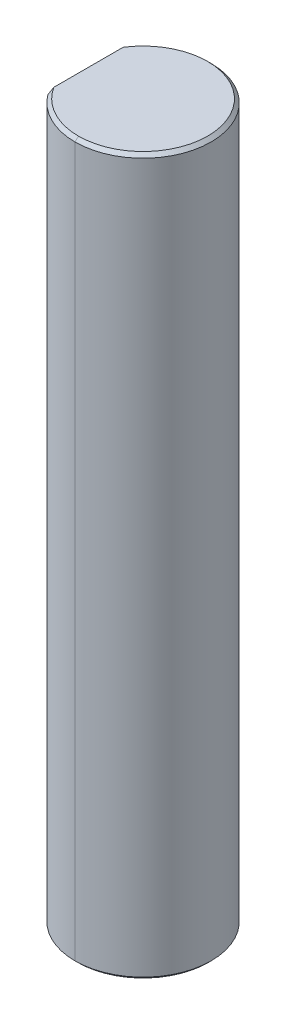
ISO-10303-21;
HEADER;
FILE_DESCRIPTION(('STEP AP214'),'2;1');
FILE_NAME('part.step','',(''),(''),'','','');
FILE_SCHEMA(('AUTOMOTIVE_DESIGN { 1 0 10303 214 1 1 1 1 }'));
ENDSEC;
DATA;
#1=APPLICATION_CONTEXT('core data for automotive mechanical design processes');
#2=APPLICATION_PROTOCOL_DEFINITION('international standard','automotive_design',2000,#1);
#3=PRODUCT_CONTEXT('',#1,'mechanical');
#4=PRODUCT('Part','Part','',(#3));
#5=PRODUCT_RELATED_PRODUCT_CATEGORY('part','',(#4));
#6=PRODUCT_DEFINITION_FORMATION('','',#4);
#7=PRODUCT_DEFINITION_CONTEXT('part definition',#1,'design');
#8=PRODUCT_DEFINITION('design','',#6,#7);
#9=PRODUCT_DEFINITION_SHAPE('','',#8);
#10=(LENGTH_UNIT() NAMED_UNIT(*) SI_UNIT(.MILLI.,.METRE.));
#11=(NAMED_UNIT(*) PLANE_ANGLE_UNIT() SI_UNIT($,.RADIAN.));
#12=(NAMED_UNIT(*) SI_UNIT($,.STERADIAN.) SOLID_ANGLE_UNIT());
#13=UNCERTAINTY_MEASURE_WITH_UNIT(LENGTH_MEASURE(1.E-05),#10,'distance_accuracy_value','');
#14=(GEOMETRIC_REPRESENTATION_CONTEXT(3) GLOBAL_UNCERTAINTY_ASSIGNED_CONTEXT((#13)) GLOBAL_UNIT_ASSIGNED_CONTEXT((#10,
#11,#12)) REPRESENTATION_CONTEXT('',''));
#15=CARTESIAN_POINT('',(0.,0.,0.));
#16=DIRECTION('',(0.,0.,1.));
#17=DIRECTION('',(1.,0.,0.));
#18=AXIS2_PLACEMENT_3D('',#15,#16,#17);
#19=CARTESIAN_POINT('',(-2.54381,203.2,-1.89353550270387));
#20=DIRECTION('',(1.,0.,0.));
#21=DIRECTION('',(0.,1.,0.));
#22=AXIS2_PLACEMENT_3D('',#19,#20,#21);
#23=PLANE('',#22);
#24=DIRECTION('',(0.,0.,1.));
#25=VECTOR('',#24,1.);
#26=CARTESIAN_POINT('',(-2.54381,33.3375,-1.89353550270387));
#27=LINE('',#26,#25);
#28=CARTESIAN_POINT('',(-2.54381,33.3375,-1.61363733146577));
#29=VERTEX_POINT('',#28);
#30=CARTESIAN_POINT('',(-2.54381,33.3375,1.61363733146577));
#31=VERTEX_POINT('',#30);
#32=EDGE_CURVE('E181',#29,#31,#27,.T.);
#33=ORIENTED_EDGE('',*,*,#32,.F.);
#34=CARTESIAN_POINT('',(-2.54381,33.3375,-1.61363733146577));
#35=CARTESIAN_POINT('',(-2.54381,33.324835972846,-1.63727892069951));
#36=CARTESIAN_POINT('',(-2.54381,33.3120182044331,-1.66083787110422));
#37=CARTESIAN_POINT('',(-2.54381,33.2860954843602,-1.70779313460007));
#38=CARTESIAN_POINT('',(-2.54381,33.2729905717043,-1.73118946921832));
#39=CARTESIAN_POINT('',(-2.54381,33.2465105768963,-1.77782826832946));
#40=CARTESIAN_POINT('',(-2.54381,33.2331354976812,-1.80107073449142));
#41=CARTESIAN_POINT('',(-2.54381,33.2061298247341,-1.84741098770331));
#42=CARTESIAN_POINT('',(-2.54381,33.1924991967487,-1.87050875479636));
#43=CARTESIAN_POINT('',(-2.54381,33.17875,-1.89353550270388));
#44=B_SPLINE_CURVE_WITH_KNOTS('',3,(#34,#35,#36,#37,#38,#39,#40,#41,#42,#43),.UNSPECIFIED.,.F.,
.F.,(4,2,2,2,4),(0.,0.0804585075196043,0.160906152924485,0.24135292424592,0.321810556729131),.UNSPECIFIED.);
#45=CARTESIAN_POINT('',(-2.54381,33.17875,-1.89353550270387));
#46=VERTEX_POINT('',#45);
#47=EDGE_CURVE('E198',#29,#46,#44,.T.);
#48=ORIENTED_EDGE('',*,*,#47,.T.);
#49=DIRECTION('',(0.,-1.,0.));
#50=VECTOR('',#49,1.);
#51=CARTESIAN_POINT('',(-2.54381,203.2,-1.89353550270387));
#52=LINE('',#51,#50);
#53=CARTESIAN_POINT('',(-2.54381,0.127000000000044,-1.89353550270387));
#54=VERTEX_POINT('',#53);
#55=EDGE_CURVE('E163',#46,#54,#52,.T.);
#56=ORIENTED_EDGE('',*,*,#55,.T.);
#57=CARTESIAN_POINT('',(-2.54381,0.127000000000044,-1.89353550270387));
#58=CARTESIAN_POINT('',(-2.54381,0.0833862535559772,-1.82049357854219));
#59=CARTESIAN_POINT('',(-2.54381,0.0409575857320699,-1.74672509100728));
#60=CARTESIAN_POINT('',(-2.54381,0.,-1.67216130800824));
#61=(BOUNDED_CURVE() B_SPLINE_CURVE(3,(#57,#58,#59,#60),.UNSPECIFIED.,.F.,
.F.) B_SPLINE_CURVE_WITH_KNOTS((4,4),(0.,0.00025521664145809),
.UNSPECIFIED.) CURVE() GEOMETRIC_REPRESENTATION_ITEM() RATIONAL_B_SPLINE_CURVE((1.,1.,1.,1.)) REPRESENTATION_ITEM(''));
#62=CARTESIAN_POINT('',(-2.54381,0.,-1.67216130800824));
#63=VERTEX_POINT('',#62);
#64=EDGE_CURVE('E129',#54,#63,#61,.T.);
#65=ORIENTED_EDGE('',*,*,#64,.T.);
#66=DIRECTION('',(0.,0.,1.));
#67=VECTOR('',#66,1.);
#68=CARTESIAN_POINT('',(-2.54381,0.,-1.89353550270387));
#69=LINE('',#68,#67);
#70=CARTESIAN_POINT('',(-2.54381,0.,1.67216130800824));
#71=VERTEX_POINT('',#70);
#72=EDGE_CURVE('E123',#63,#71,#69,.T.);
#73=ORIENTED_EDGE('',*,*,#72,.T.);
#74=CARTESIAN_POINT('',(-2.54381,0.,1.67216130800824));
#75=CARTESIAN_POINT('',(-2.54381,0.040957585732076,1.74672509100728));
#76=CARTESIAN_POINT('',(-2.54381,0.0833862535559736,1.82049357854219));
#77=CARTESIAN_POINT('',(-2.54381,0.127000000000044,1.89353550270387));
#78=(BOUNDED_CURVE() B_SPLINE_CURVE(3,(#74,#75,#76,#77),.UNSPECIFIED.,.F.,
.F.) B_SPLINE_CURVE_WITH_KNOTS((4,4),(0.,0.00025521664145809),
.UNSPECIFIED.) CURVE() GEOMETRIC_REPRESENTATION_ITEM() RATIONAL_B_SPLINE_CURVE((1.,1.,1.,1.)) REPRESENTATION_ITEM(''));
#79=CARTESIAN_POINT('',(-2.54381,0.127000000000044,1.89353550270387));
#80=VERTEX_POINT('',#79);
#81=EDGE_CURVE('E126',#71,#80,#78,.T.);
#82=ORIENTED_EDGE('',*,*,#81,.T.);
#83=DIRECTION('',(0.,-1.,0.));
#84=VECTOR('',#83,1.);
#85=CARTESIAN_POINT('',(-2.54381,203.2,1.89353550270387));
#86=LINE('',#85,#84);
#87=CARTESIAN_POINT('',(-2.54381,33.17875,1.89353550270387));
#88=VERTEX_POINT('',#87);
#89=EDGE_CURVE('E166',#88,#80,#86,.T.);
#90=ORIENTED_EDGE('',*,*,#89,.F.);
#91=CARTESIAN_POINT('',(-2.54381,33.17875,1.89353550270387));
#92=CARTESIAN_POINT('',(-2.54381,33.1924991967487,1.87050875479636));
#93=CARTESIAN_POINT('',(-2.54381,33.2061298247341,1.8474109877033));
#94=CARTESIAN_POINT('',(-2.54381,33.2331354976812,1.80107073449142));
#95=CARTESIAN_POINT('',(-2.54381,33.2465105768963,1.77782826832946));
#96=CARTESIAN_POINT('',(-2.54381,33.2729905717043,1.73118946921832));
#97=CARTESIAN_POINT('',(-2.54381,33.2860954843602,1.70779313460007));
#98=CARTESIAN_POINT('',(-2.54381,33.3120182044331,1.66083787110422));
#99=CARTESIAN_POINT('',(-2.54381,33.324835972846,1.63727892069953));
#100=CARTESIAN_POINT('',(-2.54381,33.3375,1.6136373314658));
#101=B_SPLINE_CURVE_WITH_KNOTS('',3,(#91,#92,#93,#94,#95,#96,#97,#98,#99,#100),.UNSPECIFIED.,
.F.,.F.,(4,2,2,2,4),(0.,0.0804576324832107,0.160904403804646,0.241352049209526,
0.321810556729129),.UNSPECIFIED.);
#102=EDGE_CURVE('E191',#88,#31,#101,.T.);
#103=ORIENTED_EDGE('',*,*,#102,.T.);
#104=EDGE_LOOP('',(#33,#48,#56,#65,#73,#82,#90,#103));
#105=FACE_BOUND('',#104,.T.);
#106=ADVANCED_FACE('F45',(#105),#23,.F.);
#107=CARTESIAN_POINT('',(0.,203.2,0.));
#108=DIRECTION('',(0.,-1.,0.));
#109=DIRECTION('',(0.,0.,-1.));
#110=AXIS2_PLACEMENT_3D('',#107,#108,#109);
#111=CYLINDRICAL_SURFACE('',#110,3.17119);
#112=DIRECTION('',(0.,-1.,0.));
#113=VECTOR('',#112,1.);
#114=CARTESIAN_POINT('',(0.,203.2,3.17119));
#115=LINE('',#114,#113);
#116=CARTESIAN_POINT('',(0.,33.17875,3.17119));
#117=VERTEX_POINT('',#116);
#118=CARTESIAN_POINT('',(0.,0.127000000000044,3.17119));
#119=VERTEX_POINT('',#118);
#120=EDGE_CURVE('E143',#117,#119,#115,.T.);
#121=ORIENTED_EDGE('',*,*,#120,.F.);
#122=CARTESIAN_POINT('',(0.,33.17875,0.));
#123=DIRECTION('',(0.,1.,0.));
#124=DIRECTION('',(0.,0.,1.));
#125=AXIS2_PLACEMENT_3D('',#122,#123,#124);
#126=CIRCLE('',#125,3.17119);
#127=EDGE_CURVE('E14',#117,#88,#126,.F.);
#128=ORIENTED_EDGE('',*,*,#127,.T.);
#129=ORIENTED_EDGE('',*,*,#89,.T.);
#130=CARTESIAN_POINT('',(0.,0.127000000000044,0.));
#131=DIRECTION('',(0.,1.,0.));
#132=DIRECTION('',(0.,0.,1.));
#133=AXIS2_PLACEMENT_3D('',#130,#131,#132);
#134=CIRCLE('',#133,3.17119);
#135=EDGE_CURVE('E141',#80,#119,#134,.T.);
#136=ORIENTED_EDGE('',*,*,#135,.T.);
#137=EDGE_LOOP('',(#121,#128,#129,#136));
#138=FACE_BOUND('',#137,.T.);
#139=ADVANCED_FACE('F208',(#138),#111,.T.);
#140=CARTESIAN_POINT('',(0.,203.2,0.));
#141=DIRECTION('',(0.,-1.,0.));
#142=DIRECTION('',(0.,0.,-1.));
#143=AXIS2_PLACEMENT_3D('',#140,#141,#142);
#144=CYLINDRICAL_SURFACE('',#143,3.17119);
#145=ORIENTED_EDGE('',*,*,#55,.F.);
#146=CARTESIAN_POINT('',(0.,33.17875,0.));
#147=DIRECTION('',(0.,1.,0.));
#148=DIRECTION('',(0.,0.,1.));
#149=AXIS2_PLACEMENT_3D('',#146,#147,#148);
#150=CIRCLE('',#149,3.17119);
#151=CARTESIAN_POINT('',(0.,33.17875,-3.17119));
#152=VERTEX_POINT('',#151);
#153=EDGE_CURVE('E169',#46,#152,#150,.F.);
#154=ORIENTED_EDGE('',*,*,#153,.T.);
#155=DIRECTION('',(0.,-1.,0.));
#156=VECTOR('',#155,1.);
#157=CARTESIAN_POINT('',(0.,203.2,-3.17119));
#158=LINE('',#157,#156);
#159=CARTESIAN_POINT('',(0.,0.127000000000044,-3.17119));
#160=VERTEX_POINT('',#159);
#161=EDGE_CURVE('E164',#152,#160,#158,.T.);
#162=ORIENTED_EDGE('',*,*,#161,.T.);
#163=CARTESIAN_POINT('',(0.,0.127000000000044,0.));
#164=DIRECTION('',(0.,1.,0.));
#165=DIRECTION('',(0.,0.,1.));
#166=AXIS2_PLACEMENT_3D('',#163,#164,#165);
#167=CIRCLE('',#166,3.17119);
#168=EDGE_CURVE('E160',#160,#54,#167,.T.);
#169=ORIENTED_EDGE('',*,*,#168,.T.);
#170=EDGE_LOOP('',(#145,#154,#162,#169));
#171=FACE_BOUND('',#170,.T.);
#172=ADVANCED_FACE('F242',(#171),#144,.T.);
#173=CARTESIAN_POINT('',(0.,203.2,0.));
#174=DIRECTION('',(0.,-1.,0.));
#175=DIRECTION('',(0.,0.,-1.));
#176=AXIS2_PLACEMENT_3D('',#173,#174,#175);
#177=CYLINDRICAL_SURFACE('',#176,3.17119);
#178=ORIENTED_EDGE('',*,*,#161,.F.);
#179=CARTESIAN_POINT('',(0.,33.17875,0.));
#180=DIRECTION('',(0.,1.,0.));
#181=DIRECTION('',(0.,0.,1.));
#182=AXIS2_PLACEMENT_3D('',#179,#180,#181);
#183=CIRCLE('',#182,3.17119);
#184=EDGE_CURVE('E56',#152,#117,#183,.F.);
#185=ORIENTED_EDGE('',*,*,#184,.T.);
#186=ORIENTED_EDGE('',*,*,#120,.T.);
#187=CARTESIAN_POINT('',(0.,0.127000000000044,0.));
#188=DIRECTION('',(0.,1.,0.));
#189=DIRECTION('',(0.,0.,1.));
#190=AXIS2_PLACEMENT_3D('',#187,#188,#189);
#191=CIRCLE('',#190,3.17119);
#192=EDGE_CURVE('E157',#119,#160,#191,.T.);
#193=ORIENTED_EDGE('',*,*,#192,.T.);
#194=EDGE_LOOP('',(#178,#185,#186,#193));
#195=FACE_BOUND('',#194,.T.);
#196=ADVANCED_FACE('F250',(#195),#177,.T.);
#197=CARTESIAN_POINT('',(0.,0.127000000000044,0.));
#198=DIRECTION('',(0.,1.,0.));
#199=DIRECTION('',(0.,0.,1.));
#200=AXIS2_PLACEMENT_3D('',#197,#198,#199);
#201=CONICAL_SURFACE('',#200,3.17119,0.785398163397376);
#202=DIRECTION('',(0.,0.707106781186599,-0.707106781186496));
#203=VECTOR('',#202,1.);
#204=CARTESIAN_POINT('',(0.,0.127000000000044,-3.17119));
#205=LINE('',#204,#203);
#206=CARTESIAN_POINT('',(0.,0.,-3.04419));
#207=VERTEX_POINT('',#206);
#208=EDGE_CURVE('E172',#207,#160,#205,.T.);
#209=ORIENTED_EDGE('',*,*,#208,.F.);
#210=CARTESIAN_POINT('',(0.,0.,0.));
#211=DIRECTION('',(0.,-1.,0.));
#212=DIRECTION('',(0.,0.,1.));
#213=AXIS2_PLACEMENT_3D('',#210,#211,#212);
#214=CIRCLE('',#213,3.04419);
#215=EDGE_CURVE('E133',#63,#207,#214,.T.);
#216=ORIENTED_EDGE('',*,*,#215,.F.);
#217=ORIENTED_EDGE('',*,*,#64,.F.);
#218=ORIENTED_EDGE('',*,*,#168,.F.);
#219=EDGE_LOOP('',(#209,#216,#217,#218));
#220=FACE_BOUND('',#219,.T.);
#221=ADVANCED_FACE('F246',(#220),#201,.T.);
#222=CARTESIAN_POINT('',(0.,0.,0.));
#223=DIRECTION('',(0.,1.,0.));
#224=DIRECTION('',(1.,0.,0.));
#225=AXIS2_PLACEMENT_3D('',#222,#223,#224);
#226=PLANE('',#225);
#227=ORIENTED_EDGE('',*,*,#72,.F.);
#228=ORIENTED_EDGE('',*,*,#215,.T.);
#229=CARTESIAN_POINT('',(0.,0.,0.));
#230=DIRECTION('',(0.,-1.,0.));
#231=DIRECTION('',(0.,0.,1.));
#232=AXIS2_PLACEMENT_3D('',#229,#230,#231);
#233=CIRCLE('',#232,3.04419);
#234=CARTESIAN_POINT('',(0.,0.,3.04419));
#235=VERTEX_POINT('',#234);
#236=EDGE_CURVE('E148',#207,#235,#233,.T.);
#237=ORIENTED_EDGE('',*,*,#236,.T.);
#238=CARTESIAN_POINT('',(0.,0.,0.));
#239=DIRECTION('',(0.,-1.,0.));
#240=DIRECTION('',(0.,0.,1.));
#241=AXIS2_PLACEMENT_3D('',#238,#239,#240);
#242=CIRCLE('',#241,3.04419);
#243=EDGE_CURVE('E138',#235,#71,#242,.T.);
#244=ORIENTED_EDGE('',*,*,#243,.T.);
#245=EDGE_LOOP('',(#227,#228,#237,#244));
#246=FACE_BOUND('',#245,.T.);
#247=ADVANCED_FACE('F146',(#246),#226,.F.);
#248=CARTESIAN_POINT('',(0.,0.127000000000044,0.));
#249=DIRECTION('',(0.,1.,0.));
#250=DIRECTION('',(0.,0.,1.));
#251=AXIS2_PLACEMENT_3D('',#248,#249,#250);
#252=CONICAL_SURFACE('',#251,3.17119,0.785398163397376);
#253=ORIENTED_EDGE('',*,*,#243,.F.);
#254=DIRECTION('',(0.,0.707106781186599,0.707106781186496));
#255=VECTOR('',#254,1.);
#256=CARTESIAN_POINT('',(0.,0.127000000000044,3.17119));
#257=LINE('',#256,#255);
#258=EDGE_CURVE('E150',#235,#119,#257,.T.);
#259=ORIENTED_EDGE('',*,*,#258,.T.);
#260=ORIENTED_EDGE('',*,*,#135,.F.);
#261=ORIENTED_EDGE('',*,*,#81,.F.);
#262=EDGE_LOOP('',(#253,#259,#260,#261));
#263=FACE_BOUND('',#262,.T.);
#264=ADVANCED_FACE('F136',(#263),#252,.T.);
#265=CARTESIAN_POINT('',(0.,0.127000000000044,0.));
#266=DIRECTION('',(0.,1.,0.));
#267=DIRECTION('',(0.,0.,1.));
#268=AXIS2_PLACEMENT_3D('',#265,#266,#267);
#269=CONICAL_SURFACE('',#268,3.17119,0.785398163397376);
#270=ORIENTED_EDGE('',*,*,#236,.F.);
#271=ORIENTED_EDGE('',*,*,#208,.T.);
#272=ORIENTED_EDGE('',*,*,#192,.F.);
#273=ORIENTED_EDGE('',*,*,#258,.F.);
#274=EDGE_LOOP('',(#270,#271,#272,#273));
#275=FACE_BOUND('',#274,.T.);
#276=ADVANCED_FACE('F249',(#275),#269,.T.);
#277=CARTESIAN_POINT('',(3.17119,33.3375,-3.17119));
#278=DIRECTION('',(0.,1.,0.));
#279=DIRECTION('',(0.,0.,1.));
#280=AXIS2_PLACEMENT_3D('',#277,#278,#279);
#281=PLANE('',#280);
#282=CARTESIAN_POINT('',(0.,33.3375,0.));
#283=DIRECTION('',(0.,1.,0.));
#284=DIRECTION('',(0.,0.,1.));
#285=AXIS2_PLACEMENT_3D('',#282,#283,#284);
#286=CIRCLE('',#285,3.01243999999999);
#287=CARTESIAN_POINT('',(0.,33.3375,3.01243999999999));
#288=VERTEX_POINT('',#287);
#289=CARTESIAN_POINT('',(0.,33.3375,-3.01243999999999));
#290=VERTEX_POINT('',#289);
#291=EDGE_CURVE('E187',#288,#290,#286,.T.);
#292=ORIENTED_EDGE('',*,*,#291,.T.);
#293=CARTESIAN_POINT('',(0.,33.3375,0.));
#294=DIRECTION('',(0.,1.,0.));
#295=DIRECTION('',(0.,0.,1.));
#296=AXIS2_PLACEMENT_3D('',#293,#294,#295);
#297=CIRCLE('',#296,3.01243999999999);
#298=EDGE_CURVE('E189',#290,#29,#297,.T.);
#299=ORIENTED_EDGE('',*,*,#298,.T.);
#300=ORIENTED_EDGE('',*,*,#32,.T.);
#301=CARTESIAN_POINT('',(0.,33.3375,0.));
#302=DIRECTION('',(0.,1.,0.));
#303=DIRECTION('',(0.,0.,1.));
#304=AXIS2_PLACEMENT_3D('',#301,#302,#303);
#305=CIRCLE('',#304,3.01243999999999);
#306=EDGE_CURVE('E185',#31,#288,#305,.T.);
#307=ORIENTED_EDGE('',*,*,#306,.T.);
#308=EDGE_LOOP('',(#292,#299,#300,#307));
#309=FACE_BOUND('',#308,.T.);
#310=ADVANCED_FACE('F227',(#309),#281,.T.);
#311=CARTESIAN_POINT('',(0.,33.17875,0.));
#312=DIRECTION('',(0.,-1.,0.));
#313=DIRECTION('',(0.,0.,-1.));
#314=AXIS2_PLACEMENT_3D('',#311,#312,#313);
#315=CONICAL_SURFACE('',#314,3.17119,0.785398163397495);
#316=ORIENTED_EDGE('',*,*,#102,.F.);
#317=ORIENTED_EDGE('',*,*,#127,.F.);
#318=DIRECTION('',(0.,-0.707106781186515,0.70710678118658));
#319=VECTOR('',#318,1.);
#320=CARTESIAN_POINT('',(0.,33.3375,3.01243999999999));
#321=LINE('',#320,#319);
#322=EDGE_CURVE('E51',#288,#117,#321,.T.);
#323=ORIENTED_EDGE('',*,*,#322,.F.);
#324=ORIENTED_EDGE('',*,*,#306,.F.);
#325=EDGE_LOOP('',(#316,#317,#323,#324));
#326=FACE_BOUND('',#325,.T.);
#327=ADVANCED_FACE('F48',(#326),#315,.T.);
#328=CARTESIAN_POINT('',(0.,33.17875,0.));
#329=DIRECTION('',(0.,-1.,0.));
#330=DIRECTION('',(0.,0.,-1.));
#331=AXIS2_PLACEMENT_3D('',#328,#329,#330);
#332=CONICAL_SURFACE('',#331,3.17119,0.785398163397495);
#333=ORIENTED_EDGE('',*,*,#322,.T.);
#334=ORIENTED_EDGE('',*,*,#184,.F.);
#335=DIRECTION('',(0.,-0.707106781186515,-0.70710678118658));
#336=VECTOR('',#335,1.);
#337=CARTESIAN_POINT('',(0.,33.3375,-3.01243999999999));
#338=LINE('',#337,#336);
#339=EDGE_CURVE('E234',#290,#152,#338,.T.);
#340=ORIENTED_EDGE('',*,*,#339,.F.);
#341=ORIENTED_EDGE('',*,*,#291,.F.);
#342=EDGE_LOOP('',(#333,#334,#340,#341));
#343=FACE_BOUND('',#342,.T.);
#344=ADVANCED_FACE('F218',(#343),#332,.T.);
#345=CARTESIAN_POINT('',(0.,33.17875,0.));
#346=DIRECTION('',(0.,-1.,0.));
#347=DIRECTION('',(0.,0.,-1.));
#348=AXIS2_PLACEMENT_3D('',#345,#346,#347);
#349=CONICAL_SURFACE('',#348,3.17119,0.785398163397495);
#350=ORIENTED_EDGE('',*,*,#47,.F.);
#351=ORIENTED_EDGE('',*,*,#298,.F.);
#352=ORIENTED_EDGE('',*,*,#339,.T.);
#353=ORIENTED_EDGE('',*,*,#153,.F.);
#354=EDGE_LOOP('',(#350,#351,#352,#353));
#355=FACE_BOUND('',#354,.T.);
#356=ADVANCED_FACE('F211',(#355),#349,.T.);
#357=CLOSED_SHELL('',(#106,#139,#172,#196,#221,#247,#264,#276,#310,#327,#344,#356));
#358=MANIFOLD_SOLID_BREP('B2',#357);
#359=ADVANCED_BREP_SHAPE_REPRESENTATION('',(#18,#358),#14);
#360=SHAPE_DEFINITION_REPRESENTATION(#9,#359);
ENDSEC;
END-ISO-10303-21;
